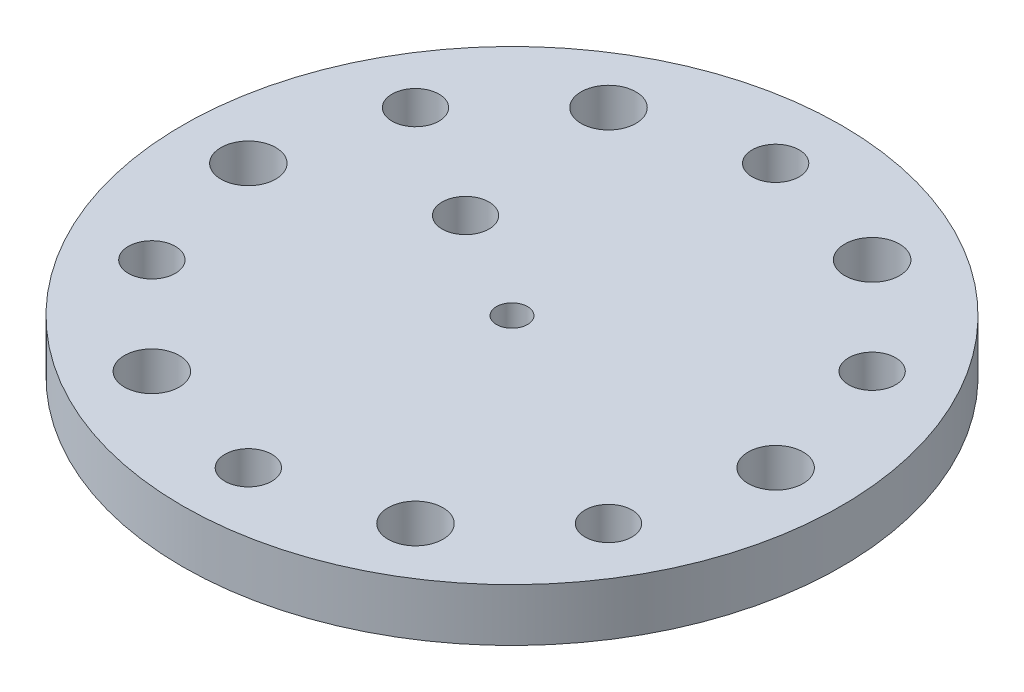
ISO-10303-21;
HEADER;
FILE_DESCRIPTION(('STEP AP214'),'2;1');
FILE_NAME('part.step','',(''),(''),'','','');
FILE_SCHEMA(('AUTOMOTIVE_DESIGN { 1 0 10303 214 1 1 1 1 }'));
ENDSEC;
DATA;
#1=APPLICATION_CONTEXT('core data for automotive mechanical design processes');
#2=APPLICATION_PROTOCOL_DEFINITION('international standard','automotive_design',2000,#1);
#3=PRODUCT_CONTEXT('',#1,'mechanical');
#4=PRODUCT('Part','Part','',(#3));
#5=PRODUCT_RELATED_PRODUCT_CATEGORY('part','',(#4));
#6=PRODUCT_DEFINITION_FORMATION('','',#4);
#7=PRODUCT_DEFINITION_CONTEXT('part definition',#1,'design');
#8=PRODUCT_DEFINITION('design','',#6,#7);
#9=PRODUCT_DEFINITION_SHAPE('','',#8);
#10=(LENGTH_UNIT() NAMED_UNIT(*) SI_UNIT(.MILLI.,.METRE.));
#11=(NAMED_UNIT(*) PLANE_ANGLE_UNIT() SI_UNIT($,.RADIAN.));
#12=(NAMED_UNIT(*) SI_UNIT($,.STERADIAN.) SOLID_ANGLE_UNIT());
#13=UNCERTAINTY_MEASURE_WITH_UNIT(LENGTH_MEASURE(1.E-05),#10,'distance_accuracy_value','');
#14=(GEOMETRIC_REPRESENTATION_CONTEXT(3) GLOBAL_UNCERTAINTY_ASSIGNED_CONTEXT((#13)) GLOBAL_UNIT_ASSIGNED_CONTEXT((#10,
#11,#12)) REPRESENTATION_CONTEXT('',''));
#15=CARTESIAN_POINT('',(0.,0.,0.));
#16=DIRECTION('',(0.,0.,1.));
#17=DIRECTION('',(1.,0.,0.));
#18=AXIS2_PLACEMENT_3D('',#15,#16,#17);
#19=CARTESIAN_POINT('',(0.,2.54,0.));
#20=DIRECTION('',(0.,-1.,0.));
#21=DIRECTION('',(0.,0.,-1.));
#22=AXIS2_PLACEMENT_3D('',#19,#20,#21);
#23=CYLINDRICAL_SURFACE('',#22,15.875);
#24=CARTESIAN_POINT('',(0.,2.54,0.));
#25=DIRECTION('',(0.,1.,0.));
#26=DIRECTION('',(0.,0.,1.));
#27=AXIS2_PLACEMENT_3D('',#24,#25,#26);
#28=CIRCLE('',#27,15.875);
#29=CARTESIAN_POINT('',(0.,2.54,15.875));
#30=VERTEX_POINT('',#29);
#31=EDGE_CURVE('E10',#30,#30,#28,.T.);
#32=ORIENTED_EDGE('',*,*,#31,.F.);
#33=EDGE_LOOP('',(#32));
#34=FACE_BOUND('',#33,.T.);
#35=CARTESIAN_POINT('',(0.,0.,0.));
#36=DIRECTION('',(0.,1.,0.));
#37=DIRECTION('',(0.,0.,1.));
#38=AXIS2_PLACEMENT_3D('',#35,#36,#37);
#39=CIRCLE('',#38,15.875);
#40=CARTESIAN_POINT('',(0.,0.,15.875));
#41=VERTEX_POINT('',#40);
#42=EDGE_CURVE('E39',#41,#41,#39,.T.);
#43=ORIENTED_EDGE('',*,*,#42,.T.);
#44=EDGE_LOOP('',(#43));
#45=FACE_BOUND('',#44,.T.);
#46=ADVANCED_FACE('F36',(#34,#45),#23,.T.);
#47=CARTESIAN_POINT('',(0.,2.54,0.));
#48=DIRECTION('',(0.,1.,0.));
#49=DIRECTION('',(0.,0.,1.));
#50=AXIS2_PLACEMENT_3D('',#47,#48,#49);
#51=PLANE('',#50);
#52=CARTESIAN_POINT('',(-5.29141521712292,2.54,-3.055));
#53=DIRECTION('',(0.,1.,0.));
#54=DIRECTION('',(0.,0.,1.));
#55=AXIS2_PLACEMENT_3D('',#52,#53,#54);
#56=CIRCLE('',#55,1.13029999999999);
#57=CARTESIAN_POINT('',(-5.29141521712292,2.54,-1.92470000000001));
#58=VERTEX_POINT('',#57);
#59=EDGE_CURVE('E157',#58,#58,#56,.T.);
#60=ORIENTED_EDGE('',*,*,#59,.F.);
#61=EDGE_LOOP('',(#60));
#62=FACE_BOUND('',#61,.T.);
#63=CARTESIAN_POINT('',(6.35000000000013,2.54,-10.9985226280623));
#64=DIRECTION('',(0.,1.,0.));
#65=DIRECTION('',(0.866025403784433,0.,0.50000000000001));
#66=AXIS2_PLACEMENT_3D('',#63,#64,#65);
#67=CIRCLE('',#66,1.3208);
#68=CARTESIAN_POINT('',(7.49384635331861,2.54,-10.3381226280623));
#69=VERTEX_POINT('',#68);
#70=EDGE_CURVE('E146',#69,#69,#67,.T.);
#71=ORIENTED_EDGE('',*,*,#70,.F.);
#72=EDGE_LOOP('',(#71));
#73=FACE_BOUND('',#72,.T.);
#74=CARTESIAN_POINT('',(-6.3499999999999,2.54,-10.9985226280624));
#75=DIRECTION('',(0.,1.,0.));
#76=DIRECTION('',(0.866025403784443,0.,-0.499999999999992));
#77=AXIS2_PLACEMENT_3D('',#74,#75,#76);
#78=CIRCLE('',#77,1.3208);
#79=CARTESIAN_POINT('',(-5.2061536466814,2.54,-11.6589226280624));
#80=VERTEX_POINT('',#79);
#81=EDGE_CURVE('E138',#80,#80,#78,.T.);
#82=ORIENTED_EDGE('',*,*,#81,.F.);
#83=EDGE_LOOP('',(#82));
#84=FACE_BOUND('',#83,.T.);
#85=CARTESIAN_POINT('',(-12.7,2.54,0.));
#86=DIRECTION('',(0.,1.,0.));
#87=DIRECTION('',(0.,0.,-1.));
#88=AXIS2_PLACEMENT_3D('',#85,#86,#87);
#89=CIRCLE('',#88,1.3208);
#90=CARTESIAN_POINT('',(-12.7,2.54,-1.3208));
#91=VERTEX_POINT('',#90);
#92=EDGE_CURVE('E131',#91,#91,#89,.T.);
#93=ORIENTED_EDGE('',*,*,#92,.F.);
#94=EDGE_LOOP('',(#93));
#95=FACE_BOUND('',#94,.T.);
#96=CARTESIAN_POINT('',(-6.35000000000005,2.54,10.9985226280623));
#97=DIRECTION('',(0.,1.,0.));
#98=DIRECTION('',(-0.866025403784436,0.,-0.500000000000004));
#99=AXIS2_PLACEMENT_3D('',#96,#97,#98);
#100=CIRCLE('',#99,1.3208);
#101=CARTESIAN_POINT('',(-7.49384635331853,2.54,10.3381226280623));
#102=VERTEX_POINT('',#101);
#103=EDGE_CURVE('E123',#102,#102,#100,.T.);
#104=ORIENTED_EDGE('',*,*,#103,.F.);
#105=EDGE_LOOP('',(#104));
#106=FACE_BOUND('',#105,.T.);
#107=CARTESIAN_POINT('',(6.34999999999997,2.54,10.9985226280624));
#108=DIRECTION('',(0.,1.,0.));
#109=DIRECTION('',(-0.86602540378444,0.,0.499999999999998));
#110=AXIS2_PLACEMENT_3D('',#107,#108,#109);
#111=CIRCLE('',#110,1.3208);
#112=CARTESIAN_POINT('',(5.20615364668149,2.54,11.6589226280624));
#113=VERTEX_POINT('',#112);
#114=EDGE_CURVE('E115',#113,#113,#111,.T.);
#115=ORIENTED_EDGE('',*,*,#114,.F.);
#116=EDGE_LOOP('',(#115));
#117=FACE_BOUND('',#116,.T.);
#118=CARTESIAN_POINT('',(12.7,2.54,0.));
#119=DIRECTION('',(0.,1.,0.));
#120=DIRECTION('',(0.,0.,1.));
#121=AXIS2_PLACEMENT_3D('',#118,#119,#120);
#122=CIRCLE('',#121,1.3208);
#123=CARTESIAN_POINT('',(12.7,2.54,1.3208));
#124=VERTEX_POINT('',#123);
#125=EDGE_CURVE('E107',#124,#124,#122,.T.);
#126=ORIENTED_EDGE('',*,*,#125,.F.);
#127=EDGE_LOOP('',(#126));
#128=FACE_BOUND('',#127,.T.);
#129=CARTESIAN_POINT('',(0.,2.54,0.));
#130=DIRECTION('',(0.,1.,0.));
#131=DIRECTION('',(0.,0.,1.));
#132=AXIS2_PLACEMENT_3D('',#129,#130,#131);
#133=CIRCLE('',#132,0.7493);
#134=CARTESIAN_POINT('',(0.,2.54,0.7493));
#135=VERTEX_POINT('',#134);
#136=EDGE_CURVE('E99',#135,#135,#133,.T.);
#137=ORIENTED_EDGE('',*,*,#136,.F.);
#138=EDGE_LOOP('',(#137));
#139=FACE_BOUND('',#138,.T.);
#140=CARTESIAN_POINT('',(-10.9985226280623,2.54,-6.35000000000013));
#141=DIRECTION('',(0.,1.,0.));
#142=DIRECTION('',(0.,0.,1.));
#143=AXIS2_PLACEMENT_3D('',#140,#141,#142);
#144=CIRCLE('',#143,1.1303);
#145=CARTESIAN_POINT('',(-10.9985226280623,2.54,-5.21970000000013));
#146=VERTEX_POINT('',#145);
#147=EDGE_CURVE('E94',#146,#146,#144,.T.);
#148=ORIENTED_EDGE('',*,*,#147,.F.);
#149=EDGE_LOOP('',(#148));
#150=FACE_BOUND('',#149,.T.);
#151=CARTESIAN_POINT('',(-10.9985226280624,2.54,6.3499999999999));
#152=DIRECTION('',(0.,1.,0.));
#153=DIRECTION('',(0.,0.,1.));
#154=AXIS2_PLACEMENT_3D('',#151,#152,#153);
#155=CIRCLE('',#154,1.1303);
#156=CARTESIAN_POINT('',(-10.9985226280624,2.54,7.4802999999999));
#157=VERTEX_POINT('',#156);
#158=EDGE_CURVE('E86',#157,#157,#155,.T.);
#159=ORIENTED_EDGE('',*,*,#158,.F.);
#160=EDGE_LOOP('',(#159));
#161=FACE_BOUND('',#160,.T.);
#162=CARTESIAN_POINT('',(0.,2.54,12.7));
#163=DIRECTION('',(0.,1.,0.));
#164=DIRECTION('',(0.,0.,1.));
#165=AXIS2_PLACEMENT_3D('',#162,#163,#164);
#166=CIRCLE('',#165,1.1303);
#167=CARTESIAN_POINT('',(0.,2.54,13.8303));
#168=VERTEX_POINT('',#167);
#169=EDGE_CURVE('E78',#168,#168,#166,.T.);
#170=ORIENTED_EDGE('',*,*,#169,.F.);
#171=EDGE_LOOP('',(#170));
#172=FACE_BOUND('',#171,.T.);
#173=CARTESIAN_POINT('',(10.9985226280623,2.54,6.35000000000005));
#174=DIRECTION('',(0.,1.,0.));
#175=DIRECTION('',(0.,0.,1.));
#176=AXIS2_PLACEMENT_3D('',#173,#174,#175);
#177=CIRCLE('',#176,1.1303);
#178=CARTESIAN_POINT('',(10.9985226280623,2.54,7.48030000000005));
#179=VERTEX_POINT('',#178);
#180=EDGE_CURVE('E70',#179,#179,#177,.T.);
#181=ORIENTED_EDGE('',*,*,#180,.F.);
#182=EDGE_LOOP('',(#181));
#183=FACE_BOUND('',#182,.T.);
#184=CARTESIAN_POINT('',(10.9985226280624,2.54,-6.34999999999997));
#185=DIRECTION('',(0.,1.,0.));
#186=DIRECTION('',(0.,0.,1.));
#187=AXIS2_PLACEMENT_3D('',#184,#185,#186);
#188=CIRCLE('',#187,1.1303);
#189=CARTESIAN_POINT('',(10.9985226280624,2.54,-5.21969999999998));
#190=VERTEX_POINT('',#189);
#191=EDGE_CURVE('E62',#190,#190,#188,.T.);
#192=ORIENTED_EDGE('',*,*,#191,.F.);
#193=EDGE_LOOP('',(#192));
#194=FACE_BOUND('',#193,.T.);
#195=CARTESIAN_POINT('',(0.,2.54,-12.7));
#196=DIRECTION('',(0.,1.,0.));
#197=DIRECTION('',(0.,0.,1.));
#198=AXIS2_PLACEMENT_3D('',#195,#196,#197);
#199=CIRCLE('',#198,1.1303);
#200=CARTESIAN_POINT('',(0.,2.54,-11.5697));
#201=VERTEX_POINT('',#200);
#202=EDGE_CURVE('E55',#201,#201,#199,.T.);
#203=ORIENTED_EDGE('',*,*,#202,.F.);
#204=EDGE_LOOP('',(#203));
#205=FACE_BOUND('',#204,.T.);
#206=ORIENTED_EDGE('',*,*,#31,.T.);
#207=EDGE_LOOP('',(#206));
#208=FACE_BOUND('',#207,.T.);
#209=ADVANCED_FACE('F164',(#62,#73,#84,#95,#106,#117,#128,#139,#150,#161,#172,#183,#194,#205,
#208),#51,.T.);
#210=CARTESIAN_POINT('',(0.,0.,0.));
#211=DIRECTION('',(0.,1.,0.));
#212=DIRECTION('',(0.,0.,1.));
#213=AXIS2_PLACEMENT_3D('',#210,#211,#212);
#214=PLANE('',#213);
#215=CARTESIAN_POINT('',(-5.29141521712292,0.,-3.055));
#216=DIRECTION('',(0.,1.,0.));
#217=DIRECTION('',(0.,0.,1.));
#218=AXIS2_PLACEMENT_3D('',#215,#216,#217);
#219=CIRCLE('',#218,1.1303);
#220=CARTESIAN_POINT('',(-5.29141521712292,0.,-1.9247));
#221=VERTEX_POINT('',#220);
#222=EDGE_CURVE('E150',#221,#221,#219,.T.);
#223=ORIENTED_EDGE('',*,*,#222,.T.);
#224=EDGE_LOOP('',(#223));
#225=FACE_BOUND('',#224,.T.);
#226=CARTESIAN_POINT('',(6.35000000000013,0.,-10.9985226280623));
#227=DIRECTION('',(0.,1.,0.));
#228=DIRECTION('',(0.866025403784433,0.,0.50000000000001));
#229=AXIS2_PLACEMENT_3D('',#226,#227,#228);
#230=CIRCLE('',#229,1.3208);
#231=CARTESIAN_POINT('',(7.49384635331861,0.,-10.3381226280623));
#232=VERTEX_POINT('',#231);
#233=EDGE_CURVE('E142',#232,#232,#230,.T.);
#234=ORIENTED_EDGE('',*,*,#233,.T.);
#235=EDGE_LOOP('',(#234));
#236=FACE_BOUND('',#235,.T.);
#237=CARTESIAN_POINT('',(-6.3499999999999,0.,-10.9985226280624));
#238=DIRECTION('',(0.,1.,0.));
#239=DIRECTION('',(0.866025403784443,0.,-0.499999999999992));
#240=AXIS2_PLACEMENT_3D('',#237,#238,#239);
#241=CIRCLE('',#240,1.3208);
#242=CARTESIAN_POINT('',(-5.2061536466814,0.,-11.6589226280624));
#243=VERTEX_POINT('',#242);
#244=EDGE_CURVE('E135',#243,#243,#241,.T.);
#245=ORIENTED_EDGE('',*,*,#244,.T.);
#246=EDGE_LOOP('',(#245));
#247=FACE_BOUND('',#246,.T.);
#248=CARTESIAN_POINT('',(-12.7,0.,0.));
#249=DIRECTION('',(0.,1.,0.));
#250=DIRECTION('',(0.,0.,-1.));
#251=AXIS2_PLACEMENT_3D('',#248,#249,#250);
#252=CIRCLE('',#251,1.3208);
#253=CARTESIAN_POINT('',(-12.7,0.,-1.3208));
#254=VERTEX_POINT('',#253);
#255=EDGE_CURVE('E127',#254,#254,#252,.T.);
#256=ORIENTED_EDGE('',*,*,#255,.T.);
#257=EDGE_LOOP('',(#256));
#258=FACE_BOUND('',#257,.T.);
#259=CARTESIAN_POINT('',(-6.35000000000005,0.,10.9985226280623));
#260=DIRECTION('',(0.,1.,0.));
#261=DIRECTION('',(-0.866025403784436,0.,-0.500000000000004));
#262=AXIS2_PLACEMENT_3D('',#259,#260,#261);
#263=CIRCLE('',#262,1.3208);
#264=CARTESIAN_POINT('',(-7.49384635331853,0.,10.3381226280623));
#265=VERTEX_POINT('',#264);
#266=EDGE_CURVE('E119',#265,#265,#263,.T.);
#267=ORIENTED_EDGE('',*,*,#266,.T.);
#268=EDGE_LOOP('',(#267));
#269=FACE_BOUND('',#268,.T.);
#270=CARTESIAN_POINT('',(6.34999999999997,0.,10.9985226280624));
#271=DIRECTION('',(0.,1.,0.));
#272=DIRECTION('',(-0.86602540378444,0.,0.499999999999998));
#273=AXIS2_PLACEMENT_3D('',#270,#271,#272);
#274=CIRCLE('',#273,1.3208);
#275=CARTESIAN_POINT('',(5.20615364668149,0.,11.6589226280624));
#276=VERTEX_POINT('',#275);
#277=EDGE_CURVE('E111',#276,#276,#274,.T.);
#278=ORIENTED_EDGE('',*,*,#277,.T.);
#279=EDGE_LOOP('',(#278));
#280=FACE_BOUND('',#279,.T.);
#281=CARTESIAN_POINT('',(12.7,0.,0.));
#282=DIRECTION('',(0.,1.,0.));
#283=DIRECTION('',(0.,0.,1.));
#284=AXIS2_PLACEMENT_3D('',#281,#282,#283);
#285=CIRCLE('',#284,1.3208);
#286=CARTESIAN_POINT('',(12.7,0.,1.3208));
#287=VERTEX_POINT('',#286);
#288=EDGE_CURVE('E103',#287,#287,#285,.T.);
#289=ORIENTED_EDGE('',*,*,#288,.T.);
#290=EDGE_LOOP('',(#289));
#291=FACE_BOUND('',#290,.T.);
#292=CARTESIAN_POINT('',(0.,0.,0.));
#293=DIRECTION('',(0.,1.,0.));
#294=DIRECTION('',(0.,0.,1.));
#295=AXIS2_PLACEMENT_3D('',#292,#293,#294);
#296=CIRCLE('',#295,0.7493);
#297=CARTESIAN_POINT('',(0.,0.,0.7493));
#298=VERTEX_POINT('',#297);
#299=EDGE_CURVE('E98',#298,#298,#296,.T.);
#300=ORIENTED_EDGE('',*,*,#299,.T.);
#301=EDGE_LOOP('',(#300));
#302=FACE_BOUND('',#301,.T.);
#303=CARTESIAN_POINT('',(-10.9985226280623,0.,-6.35000000000013));
#304=DIRECTION('',(0.,1.,0.));
#305=DIRECTION('',(0.,0.,1.));
#306=AXIS2_PLACEMENT_3D('',#303,#304,#305);
#307=CIRCLE('',#306,1.1303);
#308=CARTESIAN_POINT('',(-10.9985226280623,0.,-5.21970000000013));
#309=VERTEX_POINT('',#308);
#310=EDGE_CURVE('E90',#309,#309,#307,.T.);
#311=ORIENTED_EDGE('',*,*,#310,.T.);
#312=EDGE_LOOP('',(#311));
#313=FACE_BOUND('',#312,.T.);
#314=CARTESIAN_POINT('',(-10.9985226280624,0.,6.3499999999999));
#315=DIRECTION('',(0.,1.,0.));
#316=DIRECTION('',(0.,0.,1.));
#317=AXIS2_PLACEMENT_3D('',#314,#315,#316);
#318=CIRCLE('',#317,1.1303);
#319=CARTESIAN_POINT('',(-10.9985226280624,0.,7.4802999999999));
#320=VERTEX_POINT('',#319);
#321=EDGE_CURVE('E82',#320,#320,#318,.T.);
#322=ORIENTED_EDGE('',*,*,#321,.T.);
#323=EDGE_LOOP('',(#322));
#324=FACE_BOUND('',#323,.T.);
#325=CARTESIAN_POINT('',(0.,0.,12.7));
#326=DIRECTION('',(0.,1.,0.));
#327=DIRECTION('',(0.,0.,1.));
#328=AXIS2_PLACEMENT_3D('',#325,#326,#327);
#329=CIRCLE('',#328,1.1303);
#330=CARTESIAN_POINT('',(0.,0.,13.8303));
#331=VERTEX_POINT('',#330);
#332=EDGE_CURVE('E74',#331,#331,#329,.T.);
#333=ORIENTED_EDGE('',*,*,#332,.T.);
#334=EDGE_LOOP('',(#333));
#335=FACE_BOUND('',#334,.T.);
#336=CARTESIAN_POINT('',(10.9985226280623,0.,6.35000000000005));
#337=DIRECTION('',(0.,1.,0.));
#338=DIRECTION('',(0.,0.,1.));
#339=AXIS2_PLACEMENT_3D('',#336,#337,#338);
#340=CIRCLE('',#339,1.1303);
#341=CARTESIAN_POINT('',(10.9985226280623,0.,7.48030000000005));
#342=VERTEX_POINT('',#341);
#343=EDGE_CURVE('E66',#342,#342,#340,.T.);
#344=ORIENTED_EDGE('',*,*,#343,.T.);
#345=EDGE_LOOP('',(#344));
#346=FACE_BOUND('',#345,.T.);
#347=CARTESIAN_POINT('',(10.9985226280624,0.,-6.34999999999997));
#348=DIRECTION('',(0.,1.,0.));
#349=DIRECTION('',(0.,0.,1.));
#350=AXIS2_PLACEMENT_3D('',#347,#348,#349);
#351=CIRCLE('',#350,1.1303);
#352=CARTESIAN_POINT('',(10.9985226280624,0.,-5.21969999999998));
#353=VERTEX_POINT('',#352);
#354=EDGE_CURVE('E59',#353,#353,#351,.T.);
#355=ORIENTED_EDGE('',*,*,#354,.T.);
#356=EDGE_LOOP('',(#355));
#357=FACE_BOUND('',#356,.T.);
#358=CARTESIAN_POINT('',(0.,0.,-12.7));
#359=DIRECTION('',(0.,1.,0.));
#360=DIRECTION('',(0.,0.,1.));
#361=AXIS2_PLACEMENT_3D('',#358,#359,#360);
#362=CIRCLE('',#361,1.1303);
#363=CARTESIAN_POINT('',(0.,0.,-11.5697));
#364=VERTEX_POINT('',#363);
#365=EDGE_CURVE('E50',#364,#364,#362,.T.);
#366=ORIENTED_EDGE('',*,*,#365,.T.);
#367=EDGE_LOOP('',(#366));
#368=FACE_BOUND('',#367,.T.);
#369=ORIENTED_EDGE('',*,*,#42,.F.);
#370=EDGE_LOOP('',(#369));
#371=FACE_BOUND('',#370,.T.);
#372=ADVANCED_FACE('F167',(#225,#236,#247,#258,#269,#280,#291,#302,#313,#324,#335,#346,#357,
#368,#371),#214,.F.);
#373=CARTESIAN_POINT('',(0.,2.54,-12.7));
#374=DIRECTION('',(0.,1.,0.));
#375=DIRECTION('',(0.,0.,1.));
#376=AXIS2_PLACEMENT_3D('',#373,#374,#375);
#377=CYLINDRICAL_SURFACE('',#376,1.1303);
#378=ORIENTED_EDGE('',*,*,#365,.F.);
#379=EDGE_LOOP('',(#378));
#380=FACE_BOUND('',#379,.T.);
#381=ORIENTED_EDGE('',*,*,#202,.T.);
#382=EDGE_LOOP('',(#381));
#383=FACE_BOUND('',#382,.T.);
#384=ADVANCED_FACE('F195',(#380,#383),#377,.F.);
#385=CARTESIAN_POINT('',(10.9985226280624,2.54,-6.34999999999997));
#386=DIRECTION('',(0.,1.,0.));
#387=DIRECTION('',(0.,0.,1.));
#388=AXIS2_PLACEMENT_3D('',#385,#386,#387);
#389=CYLINDRICAL_SURFACE('',#388,1.1303);
#390=ORIENTED_EDGE('',*,*,#354,.F.);
#391=EDGE_LOOP('',(#390));
#392=FACE_BOUND('',#391,.T.);
#393=ORIENTED_EDGE('',*,*,#191,.T.);
#394=EDGE_LOOP('',(#393));
#395=FACE_BOUND('',#394,.T.);
#396=ADVANCED_FACE('F197',(#392,#395),#389,.F.);
#397=CARTESIAN_POINT('',(10.9985226280623,2.54,6.35000000000005));
#398=DIRECTION('',(0.,1.,0.));
#399=DIRECTION('',(0.,0.,1.));
#400=AXIS2_PLACEMENT_3D('',#397,#398,#399);
#401=CYLINDRICAL_SURFACE('',#400,1.1303);
#402=ORIENTED_EDGE('',*,*,#343,.F.);
#403=EDGE_LOOP('',(#402));
#404=FACE_BOUND('',#403,.T.);
#405=ORIENTED_EDGE('',*,*,#180,.T.);
#406=EDGE_LOOP('',(#405));
#407=FACE_BOUND('',#406,.T.);
#408=ADVANCED_FACE('F204',(#404,#407),#401,.F.);
#409=CARTESIAN_POINT('',(0.,2.54,12.7));
#410=DIRECTION('',(0.,1.,0.));
#411=DIRECTION('',(0.,0.,1.));
#412=AXIS2_PLACEMENT_3D('',#409,#410,#411);
#413=CYLINDRICAL_SURFACE('',#412,1.1303);
#414=ORIENTED_EDGE('',*,*,#332,.F.);
#415=EDGE_LOOP('',(#414));
#416=FACE_BOUND('',#415,.T.);
#417=ORIENTED_EDGE('',*,*,#169,.T.);
#418=EDGE_LOOP('',(#417));
#419=FACE_BOUND('',#418,.T.);
#420=ADVANCED_FACE('F238',(#416,#419),#413,.F.);
#421=CARTESIAN_POINT('',(-10.9985226280624,2.54,6.3499999999999));
#422=DIRECTION('',(0.,1.,0.));
#423=DIRECTION('',(0.,0.,1.));
#424=AXIS2_PLACEMENT_3D('',#421,#422,#423);
#425=CYLINDRICAL_SURFACE('',#424,1.1303);
#426=ORIENTED_EDGE('',*,*,#321,.F.);
#427=EDGE_LOOP('',(#426));
#428=FACE_BOUND('',#427,.T.);
#429=ORIENTED_EDGE('',*,*,#158,.T.);
#430=EDGE_LOOP('',(#429));
#431=FACE_BOUND('',#430,.T.);
#432=ADVANCED_FACE('F247',(#428,#431),#425,.F.);
#433=CARTESIAN_POINT('',(-10.9985226280623,2.54,-6.35000000000013));
#434=DIRECTION('',(0.,1.,0.));
#435=DIRECTION('',(0.,0.,1.));
#436=AXIS2_PLACEMENT_3D('',#433,#434,#435);
#437=CYLINDRICAL_SURFACE('',#436,1.1303);
#438=ORIENTED_EDGE('',*,*,#310,.F.);
#439=EDGE_LOOP('',(#438));
#440=FACE_BOUND('',#439,.T.);
#441=ORIENTED_EDGE('',*,*,#147,.T.);
#442=EDGE_LOOP('',(#441));
#443=FACE_BOUND('',#442,.T.);
#444=ADVANCED_FACE('F256',(#440,#443),#437,.F.);
#445=CARTESIAN_POINT('',(0.,0.,0.));
#446=DIRECTION('',(0.,1.,0.));
#447=DIRECTION('',(0.,0.,1.));
#448=AXIS2_PLACEMENT_3D('',#445,#446,#447);
#449=CYLINDRICAL_SURFACE('',#448,0.7493);
#450=ORIENTED_EDGE('',*,*,#299,.F.);
#451=EDGE_LOOP('',(#450));
#452=FACE_BOUND('',#451,.T.);
#453=ORIENTED_EDGE('',*,*,#136,.T.);
#454=EDGE_LOOP('',(#453));
#455=FACE_BOUND('',#454,.T.);
#456=ADVANCED_FACE('F265',(#452,#455),#449,.F.);
#457=CARTESIAN_POINT('',(12.7,0.,0.));
#458=DIRECTION('',(0.,1.,0.));
#459=DIRECTION('',(0.,0.,1.));
#460=AXIS2_PLACEMENT_3D('',#457,#458,#459);
#461=CYLINDRICAL_SURFACE('',#460,1.3208);
#462=ORIENTED_EDGE('',*,*,#288,.F.);
#463=EDGE_LOOP('',(#462));
#464=FACE_BOUND('',#463,.T.);
#465=ORIENTED_EDGE('',*,*,#125,.T.);
#466=EDGE_LOOP('',(#465));
#467=FACE_BOUND('',#466,.T.);
#468=ADVANCED_FACE('F274',(#464,#467),#461,.F.);
#469=CARTESIAN_POINT('',(6.34999999999997,0.,10.9985226280624));
#470=DIRECTION('',(0.,1.,0.));
#471=DIRECTION('',(0.,0.,1.));
#472=AXIS2_PLACEMENT_3D('',#469,#470,#471);
#473=CYLINDRICAL_SURFACE('',#472,1.3208);
#474=ORIENTED_EDGE('',*,*,#277,.F.);
#475=EDGE_LOOP('',(#474));
#476=FACE_BOUND('',#475,.T.);
#477=ORIENTED_EDGE('',*,*,#114,.T.);
#478=EDGE_LOOP('',(#477));
#479=FACE_BOUND('',#478,.T.);
#480=ADVANCED_FACE('F283',(#476,#479),#473,.F.);
#481=CARTESIAN_POINT('',(-6.35000000000005,0.,10.9985226280623));
#482=DIRECTION('',(0.,1.,0.));
#483=DIRECTION('',(0.,0.,1.));
#484=AXIS2_PLACEMENT_3D('',#481,#482,#483);
#485=CYLINDRICAL_SURFACE('',#484,1.3208);
#486=ORIENTED_EDGE('',*,*,#266,.F.);
#487=EDGE_LOOP('',(#486));
#488=FACE_BOUND('',#487,.T.);
#489=ORIENTED_EDGE('',*,*,#103,.T.);
#490=EDGE_LOOP('',(#489));
#491=FACE_BOUND('',#490,.T.);
#492=ADVANCED_FACE('F292',(#488,#491),#485,.F.);
#493=CARTESIAN_POINT('',(-12.7,0.,0.));
#494=DIRECTION('',(0.,1.,0.));
#495=DIRECTION('',(0.,0.,1.));
#496=AXIS2_PLACEMENT_3D('',#493,#494,#495);
#497=CYLINDRICAL_SURFACE('',#496,1.3208);
#498=ORIENTED_EDGE('',*,*,#255,.F.);
#499=EDGE_LOOP('',(#498));
#500=FACE_BOUND('',#499,.T.);
#501=ORIENTED_EDGE('',*,*,#92,.T.);
#502=EDGE_LOOP('',(#501));
#503=FACE_BOUND('',#502,.T.);
#504=ADVANCED_FACE('F301',(#500,#503),#497,.F.);
#505=CARTESIAN_POINT('',(-6.3499999999999,0.,-10.9985226280624));
#506=DIRECTION('',(0.,1.,0.));
#507=DIRECTION('',(0.,0.,1.));
#508=AXIS2_PLACEMENT_3D('',#505,#506,#507);
#509=CYLINDRICAL_SURFACE('',#508,1.3208);
#510=ORIENTED_EDGE('',*,*,#244,.F.);
#511=EDGE_LOOP('',(#510));
#512=FACE_BOUND('',#511,.T.);
#513=ORIENTED_EDGE('',*,*,#81,.T.);
#514=EDGE_LOOP('',(#513));
#515=FACE_BOUND('',#514,.T.);
#516=ADVANCED_FACE('F310',(#512,#515),#509,.F.);
#517=CARTESIAN_POINT('',(6.35000000000013,0.,-10.9985226280623));
#518=DIRECTION('',(0.,1.,0.));
#519=DIRECTION('',(0.,0.,1.));
#520=AXIS2_PLACEMENT_3D('',#517,#518,#519);
#521=CYLINDRICAL_SURFACE('',#520,1.3208);
#522=ORIENTED_EDGE('',*,*,#233,.F.);
#523=EDGE_LOOP('',(#522));
#524=FACE_BOUND('',#523,.T.);
#525=ORIENTED_EDGE('',*,*,#70,.T.);
#526=EDGE_LOOP('',(#525));
#527=FACE_BOUND('',#526,.T.);
#528=ADVANCED_FACE('F319',(#524,#527),#521,.F.);
#529=CARTESIAN_POINT('',(-5.29141521712292,2.54,-3.055));
#530=DIRECTION('',(0.,1.,0.));
#531=DIRECTION('',(0.,0.,1.));
#532=AXIS2_PLACEMENT_3D('',#529,#530,#531);
#533=CYLINDRICAL_SURFACE('',#532,1.13029999999999);
#534=ORIENTED_EDGE('',*,*,#222,.F.);
#535=EDGE_LOOP('',(#534));
#536=FACE_BOUND('',#535,.T.);
#537=ORIENTED_EDGE('',*,*,#59,.T.);
#538=EDGE_LOOP('',(#537));
#539=FACE_BOUND('',#538,.T.);
#540=ADVANCED_FACE('F162',(#536,#539),#533,.F.);
#541=CLOSED_SHELL('',(#46,#209,#372,#384,#396,#408,#420,#432,#444,#456,#468,#480,#492,#504,#516,
#528,#540));
#542=MANIFOLD_SOLID_BREP('B2',#541);
#543=ADVANCED_BREP_SHAPE_REPRESENTATION('',(#18,#542),#14);
#544=SHAPE_DEFINITION_REPRESENTATION(#9,#543);
ENDSEC;
END-ISO-10303-21;
